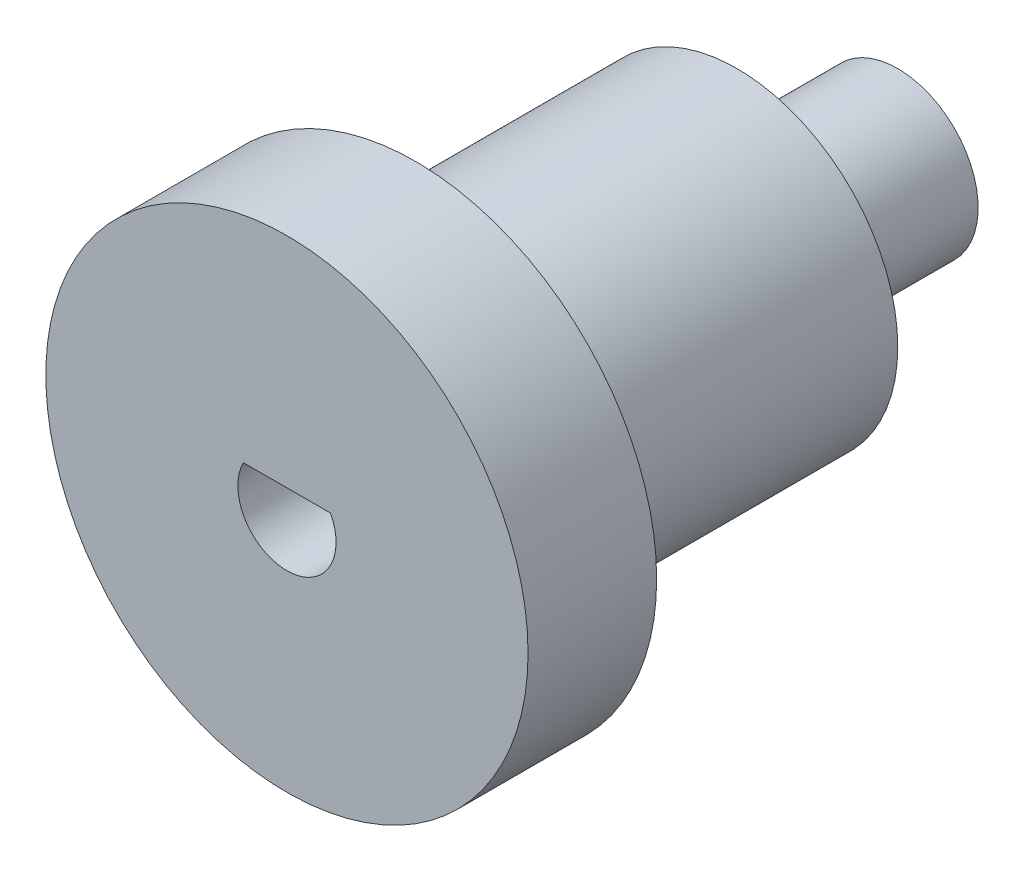
ISO-10303-21;
HEADER;
FILE_DESCRIPTION(('STEP AP214'),'2;1');
FILE_NAME('part.step','',(''),(''),'','','');
FILE_SCHEMA(('AUTOMOTIVE_DESIGN { 1 0 10303 214 1 1 1 1 }'));
ENDSEC;
DATA;
#1=APPLICATION_CONTEXT('core data for automotive mechanical design processes');
#2=APPLICATION_PROTOCOL_DEFINITION('international standard','automotive_design',2000,#1);
#3=PRODUCT_CONTEXT('',#1,'mechanical');
#4=PRODUCT('Part','Part','',(#3));
#5=PRODUCT_RELATED_PRODUCT_CATEGORY('part','',(#4));
#6=PRODUCT_DEFINITION_FORMATION('','',#4);
#7=PRODUCT_DEFINITION_CONTEXT('part definition',#1,'design');
#8=PRODUCT_DEFINITION('design','',#6,#7);
#9=PRODUCT_DEFINITION_SHAPE('','',#8);
#10=(LENGTH_UNIT() NAMED_UNIT(*) SI_UNIT(.MILLI.,.METRE.));
#11=(NAMED_UNIT(*) PLANE_ANGLE_UNIT() SI_UNIT($,.RADIAN.));
#12=(NAMED_UNIT(*) SI_UNIT($,.STERADIAN.) SOLID_ANGLE_UNIT());
#13=UNCERTAINTY_MEASURE_WITH_UNIT(LENGTH_MEASURE(1.E-05),#10,'distance_accuracy_value','');
#14=(GEOMETRIC_REPRESENTATION_CONTEXT(3) GLOBAL_UNCERTAINTY_ASSIGNED_CONTEXT((#13)) GLOBAL_UNIT_ASSIGNED_CONTEXT((#10,
#11,#12)) REPRESENTATION_CONTEXT('',''));
#15=CARTESIAN_POINT('',(0.,0.,0.));
#16=DIRECTION('',(0.,0.,1.));
#17=DIRECTION('',(1.,0.,0.));
#18=AXIS2_PLACEMENT_3D('',#15,#16,#17);
#19=CARTESIAN_POINT('',(0.,0.,-12.7));
#20=DIRECTION('',(0.,0.,-1.));
#21=DIRECTION('',(-1.,0.,0.));
#22=AXIS2_PLACEMENT_3D('',#19,#20,#21);
#23=PLANE('',#22);
#24=CARTESIAN_POINT('',(0.,0.,-12.7));
#25=DIRECTION('',(0.,0.,-1.));
#26=DIRECTION('',(-1.,0.,0.));
#27=AXIS2_PLACEMENT_3D('',#24,#25,#26);
#28=CIRCLE('',#27,6.35);
#29=CARTESIAN_POINT('',(-6.35,0.,-12.7));
#30=VERTEX_POINT('',#29);
#31=EDGE_CURVE('E71',#30,#30,#28,.T.);
#32=ORIENTED_EDGE('',*,*,#31,.T.);
#33=EDGE_LOOP('',(#32));
#34=FACE_BOUND('',#33,.T.);
#35=CARTESIAN_POINT('',(0.,0.,-12.7));
#36=DIRECTION('',(0.,0.,-1.));
#37=DIRECTION('',(-1.,0.,0.));
#38=AXIS2_PLACEMENT_3D('',#35,#36,#37);
#39=CIRCLE('',#38,3.175);
#40=CARTESIAN_POINT('',(-3.175,0.,-12.7));
#41=VERTEX_POINT('',#40);
#42=EDGE_CURVE('E122',#41,#41,#39,.T.);
#43=ORIENTED_EDGE('',*,*,#42,.F.);
#44=EDGE_LOOP('',(#43));
#45=FACE_BOUND('',#44,.T.);
#46=ADVANCED_FACE('F34',(#34,#45),#23,.T.);
#47=CARTESIAN_POINT('',(0.,0.,0.));
#48=DIRECTION('',(0.,0.,1.));
#49=DIRECTION('',(1.,0.,0.));
#50=AXIS2_PLACEMENT_3D('',#47,#48,#49);
#51=PLANE('',#50);
#52=CARTESIAN_POINT('',(0.,0.,0.));
#53=DIRECTION('',(0.,0.,1.));
#54=DIRECTION('',(1.,0.,0.));
#55=AXIS2_PLACEMENT_3D('',#52,#53,#54);
#56=CIRCLE('',#55,9.525);
#57=CARTESIAN_POINT('',(9.525,0.,0.));
#58=VERTEX_POINT('',#57);
#59=EDGE_CURVE('E80',#58,#58,#56,.T.);
#60=ORIENTED_EDGE('',*,*,#59,.F.);
#61=EDGE_LOOP('',(#60));
#62=FACE_BOUND('',#61,.T.);
#63=CARTESIAN_POINT('',(0.,0.,0.));
#64=DIRECTION('',(0.,0.,1.));
#65=DIRECTION('',(1.,0.,0.));
#66=AXIS2_PLACEMENT_3D('',#63,#64,#65);
#67=CIRCLE('',#66,6.35);
#68=CARTESIAN_POINT('',(6.35,0.,0.));
#69=VERTEX_POINT('',#68);
#70=EDGE_CURVE('E11',#69,#69,#67,.F.);
#71=ORIENTED_EDGE('',*,*,#70,.F.);
#72=EDGE_LOOP('',(#71));
#73=FACE_BOUND('',#72,.T.);
#74=ADVANCED_FACE('F86',(#62,#73),#51,.F.);
#75=CARTESIAN_POINT('',(0.,0.,5.08));
#76=DIRECTION('',(0.,0.,1.));
#77=DIRECTION('',(1.,0.,0.));
#78=AXIS2_PLACEMENT_3D('',#75,#76,#77);
#79=PLANE('',#78);
#80=CARTESIAN_POINT('',(0.,0.,5.08));
#81=DIRECTION('',(0.,0.,1.));
#82=DIRECTION('',(1.,0.,0.));
#83=AXIS2_PLACEMENT_3D('',#80,#81,#82);
#84=CIRCLE('',#83,9.525);
#85=CARTESIAN_POINT('',(9.525,0.,5.08));
#86=VERTEX_POINT('',#85);
#87=EDGE_CURVE('E42',#86,#86,#84,.T.);
#88=ORIENTED_EDGE('',*,*,#87,.T.);
#89=EDGE_LOOP('',(#88));
#90=FACE_BOUND('',#89,.T.);
#91=DIRECTION('',(-1.,0.,0.));
#92=VECTOR('',#91,1.);
#93=CARTESIAN_POINT('',(-1.72122780344341,0.89497198204936,5.08));
#94=LINE('',#93,#92);
#95=CARTESIAN_POINT('',(1.72122780344341,0.89497198204936,5.08));
#96=VERTEX_POINT('',#95);
#97=CARTESIAN_POINT('',(-1.72122780344341,0.89497198204936,5.08));
#98=VERTEX_POINT('',#97);
#99=EDGE_CURVE('E55',#96,#98,#94,.T.);
#100=ORIENTED_EDGE('',*,*,#99,.F.);
#101=CARTESIAN_POINT('',(0.,0.,5.08));
#102=DIRECTION('',(0.,0.,1.));
#103=DIRECTION('',(1.,0.,0.));
#104=AXIS2_PLACEMENT_3D('',#101,#102,#103);
#105=CIRCLE('',#104,1.94);
#106=EDGE_CURVE('E74',#98,#96,#105,.T.);
#107=ORIENTED_EDGE('',*,*,#106,.F.);
#108=EDGE_LOOP('',(#100,#107));
#109=FACE_BOUND('',#108,.T.);
#110=ADVANCED_FACE('F89',(#90,#109),#79,.T.);
#111=CARTESIAN_POINT('',(0.,0.,5.08));
#112=DIRECTION('',(0.,0.,-1.));
#113=DIRECTION('',(-1.,0.,0.));
#114=AXIS2_PLACEMENT_3D('',#111,#112,#113);
#115=CYLINDRICAL_SURFACE('',#114,9.525);
#116=ORIENTED_EDGE('',*,*,#87,.F.);
#117=EDGE_LOOP('',(#116));
#118=FACE_BOUND('',#117,.T.);
#119=ORIENTED_EDGE('',*,*,#59,.T.);
#120=EDGE_LOOP('',(#119));
#121=FACE_BOUND('',#120,.T.);
#122=ADVANCED_FACE('F36',(#118,#121),#115,.T.);
#123=CARTESIAN_POINT('',(0.,0.,5.08));
#124=DIRECTION('',(0.,0.,-1.));
#125=DIRECTION('',(-1.,0.,0.));
#126=AXIS2_PLACEMENT_3D('',#123,#124,#125);
#127=CYLINDRICAL_SURFACE('',#126,1.94);
#128=CARTESIAN_POINT('',(0.,0.,0.));
#129=DIRECTION('',(0.,0.,1.));
#130=DIRECTION('',(1.,0.,0.));
#131=AXIS2_PLACEMENT_3D('',#128,#129,#130);
#132=CIRCLE('',#131,1.94);
#133=CARTESIAN_POINT('',(-1.72122780344341,0.89497198204936,0.));
#134=VERTEX_POINT('',#133);
#135=CARTESIAN_POINT('',(1.72122780344341,0.89497198204936,0.));
#136=VERTEX_POINT('',#135);
#137=EDGE_CURVE('E68',#134,#136,#132,.T.);
#138=ORIENTED_EDGE('',*,*,#137,.F.);
#139=DIRECTION('',(0.,0.,-1.));
#140=VECTOR('',#139,1.);
#141=CARTESIAN_POINT('',(-1.72122780344341,0.89497198204936,5.08));
#142=LINE('',#141,#140);
#143=EDGE_CURVE('E59',#98,#134,#142,.T.);
#144=ORIENTED_EDGE('',*,*,#143,.F.);
#145=ORIENTED_EDGE('',*,*,#106,.T.);
#146=DIRECTION('',(0.,0.,-1.));
#147=VECTOR('',#146,1.);
#148=CARTESIAN_POINT('',(1.72122780344341,0.89497198204936,5.08));
#149=LINE('',#148,#147);
#150=EDGE_CURVE('E49',#96,#136,#149,.T.);
#151=ORIENTED_EDGE('',*,*,#150,.T.);
#152=EDGE_LOOP('',(#138,#144,#145,#151));
#153=FACE_BOUND('',#152,.T.);
#154=ADVANCED_FACE('F69',(#153),#127,.F.);
#155=CARTESIAN_POINT('',(-1.72122780344341,0.89497198204936,5.08));
#156=DIRECTION('',(0.,-1.,0.));
#157=DIRECTION('',(0.,0.,-1.));
#158=AXIS2_PLACEMENT_3D('',#155,#156,#157);
#159=PLANE('',#158);
#160=DIRECTION('',(-1.,0.,0.));
#161=VECTOR('',#160,1.);
#162=CARTESIAN_POINT('',(-1.72122780344341,0.89497198204936,0.));
#163=LINE('',#162,#161);
#164=EDGE_CURVE('E63',#136,#134,#163,.T.);
#165=ORIENTED_EDGE('',*,*,#164,.F.);
#166=ORIENTED_EDGE('',*,*,#150,.F.);
#167=ORIENTED_EDGE('',*,*,#99,.T.);
#168=ORIENTED_EDGE('',*,*,#143,.T.);
#169=EDGE_LOOP('',(#165,#166,#167,#168));
#170=FACE_BOUND('',#169,.T.);
#171=ADVANCED_FACE('F61',(#170),#159,.T.);
#172=CARTESIAN_POINT('',(0.,0.,0.));
#173=DIRECTION('',(0.,0.,-1.));
#174=DIRECTION('',(-1.,0.,0.));
#175=AXIS2_PLACEMENT_3D('',#172,#173,#174);
#176=PLANE('',#175);
#177=ORIENTED_EDGE('',*,*,#137,.T.);
#178=ORIENTED_EDGE('',*,*,#164,.T.);
#179=EDGE_LOOP('',(#177,#178));
#180=FACE_BOUND('',#179,.T.);
#181=ADVANCED_FACE('F73',(#180),#176,.F.);
#182=CARTESIAN_POINT('',(0.,0.,-12.7));
#183=DIRECTION('',(0.,0.,1.));
#184=DIRECTION('',(1.,0.,0.));
#185=AXIS2_PLACEMENT_3D('',#182,#183,#184);
#186=CYLINDRICAL_SURFACE('',#185,6.35);
#187=ORIENTED_EDGE('',*,*,#31,.F.);
#188=EDGE_LOOP('',(#187));
#189=FACE_BOUND('',#188,.T.);
#190=ORIENTED_EDGE('',*,*,#70,.T.);
#191=EDGE_LOOP('',(#190));
#192=FACE_BOUND('',#191,.T.);
#193=ADVANCED_FACE('F92',(#189,#192),#186,.T.);
#194=CARTESIAN_POINT('',(0.,0.,-19.05));
#195=DIRECTION('',(0.,0.,1.));
#196=DIRECTION('',(1.,0.,0.));
#197=AXIS2_PLACEMENT_3D('',#194,#195,#196);
#198=CYLINDRICAL_SURFACE('',#197,3.175);
#199=CARTESIAN_POINT('',(0.,0.,-19.05));
#200=DIRECTION('',(0.,0.,-1.));
#201=DIRECTION('',(-1.,0.,0.));
#202=AXIS2_PLACEMENT_3D('',#199,#200,#201);
#203=CIRCLE('',#202,3.175);
#204=CARTESIAN_POINT('',(-3.175,0.,-19.05));
#205=VERTEX_POINT('',#204);
#206=EDGE_CURVE('E121',#205,#205,#203,.T.);
#207=ORIENTED_EDGE('',*,*,#206,.F.);
#208=EDGE_LOOP('',(#207));
#209=FACE_BOUND('',#208,.T.);
#210=ORIENTED_EDGE('',*,*,#42,.T.);
#211=EDGE_LOOP('',(#210));
#212=FACE_BOUND('',#211,.T.);
#213=ADVANCED_FACE('F94',(#209,#212),#198,.T.);
#214=CARTESIAN_POINT('',(0.,0.,-19.05));
#215=DIRECTION('',(0.,0.,-1.));
#216=DIRECTION('',(-1.,0.,0.));
#217=AXIS2_PLACEMENT_3D('',#214,#215,#216);
#218=PLANE('',#217);
#219=ORIENTED_EDGE('',*,*,#206,.T.);
#220=EDGE_LOOP('',(#219));
#221=FACE_BOUND('',#220,.T.);
#222=ADVANCED_FACE('F101',(#221),#218,.T.);
#223=CLOSED_SHELL('',(#46,#74,#110,#122,#154,#171,#181,#193,#213,#222));
#224=MANIFOLD_SOLID_BREP('B2',#223);
#225=ADVANCED_BREP_SHAPE_REPRESENTATION('',(#18,#224),#14);
#226=SHAPE_DEFINITION_REPRESENTATION(#9,#225);
ENDSEC;
END-ISO-10303-21;
